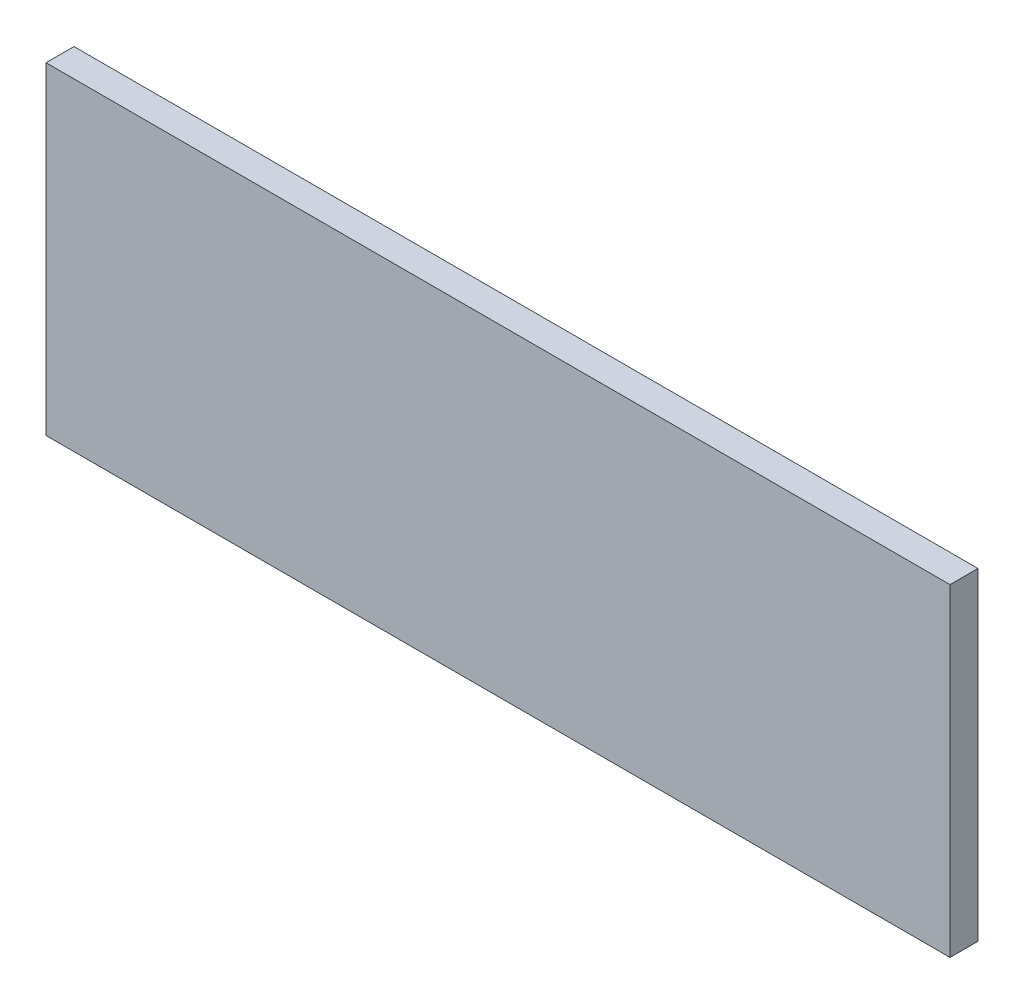
ISO-10303-21;
HEADER;
FILE_DESCRIPTION(('STEP AP214'),'2;1');
FILE_NAME('part.step','',(''),(''),'','','');
FILE_SCHEMA(('AUTOMOTIVE_DESIGN { 1 0 10303 214 1 1 1 1 }'));
ENDSEC;
DATA;
#1=APPLICATION_CONTEXT('core data for automotive mechanical design processes');
#2=APPLICATION_PROTOCOL_DEFINITION('international standard','automotive_design',2000,#1);
#3=PRODUCT_CONTEXT('',#1,'mechanical');
#4=PRODUCT('Part','Part','',(#3));
#5=PRODUCT_RELATED_PRODUCT_CATEGORY('part','',(#4));
#6=PRODUCT_DEFINITION_FORMATION('','',#4);
#7=PRODUCT_DEFINITION_CONTEXT('part definition',#1,'design');
#8=PRODUCT_DEFINITION('design','',#6,#7);
#9=PRODUCT_DEFINITION_SHAPE('','',#8);
#10=(LENGTH_UNIT() NAMED_UNIT(*) SI_UNIT(.MILLI.,.METRE.));
#11=(NAMED_UNIT(*) PLANE_ANGLE_UNIT() SI_UNIT($,.RADIAN.));
#12=(NAMED_UNIT(*) SI_UNIT($,.STERADIAN.) SOLID_ANGLE_UNIT());
#13=UNCERTAINTY_MEASURE_WITH_UNIT(LENGTH_MEASURE(1.E-05),#10,'distance_accuracy_value','');
#14=(GEOMETRIC_REPRESENTATION_CONTEXT(3) GLOBAL_UNCERTAINTY_ASSIGNED_CONTEXT((#13)) GLOBAL_UNIT_ASSIGNED_CONTEXT((#10,
#11,#12)) REPRESENTATION_CONTEXT('',''));
#15=CARTESIAN_POINT('',(0.,0.,0.));
#16=DIRECTION('',(0.,0.,1.));
#17=DIRECTION('',(1.,0.,0.));
#18=AXIS2_PLACEMENT_3D('',#15,#16,#17);
#19=CARTESIAN_POINT('',(-69.2801317233809,161.507142857143,13.));
#20=DIRECTION('',(1.,0.,0.));
#21=DIRECTION('',(0.,1.,0.));
#22=AXIS2_PLACEMENT_3D('',#19,#20,#21);
#23=PLANE('',#22);
#24=DIRECTION('',(0.,-1.,0.));
#25=VECTOR('',#24,1.);
#26=CARTESIAN_POINT('',(-69.2801317233809,161.507142857143,0.));
#27=LINE('',#26,#25);
#28=CARTESIAN_POINT('',(-69.2801317233809,161.507142857143,0.));
#29=VERTEX_POINT('',#28);
#30=CARTESIAN_POINT('',(-69.2801317233809,11.5071428571429,0.));
#31=VERTEX_POINT('',#30);
#32=EDGE_CURVE('E96',#29,#31,#27,.T.);
#33=ORIENTED_EDGE('',*,*,#32,.T.);
#34=DIRECTION('',(0.,0.,-1.));
#35=VECTOR('',#34,1.);
#36=CARTESIAN_POINT('',(-69.2801317233809,11.5071428571429,13.));
#37=LINE('',#36,#35);
#38=CARTESIAN_POINT('',(-69.2801317233809,11.5071428571429,13.));
#39=VERTEX_POINT('',#38);
#40=EDGE_CURVE('E11',#39,#31,#37,.T.);
#41=ORIENTED_EDGE('',*,*,#40,.F.);
#42=DIRECTION('',(0.,-1.,0.));
#43=VECTOR('',#42,1.);
#44=CARTESIAN_POINT('',(-69.2801317233809,161.507142857143,13.));
#45=LINE('',#44,#43);
#46=CARTESIAN_POINT('',(-69.2801317233809,161.507142857143,13.));
#47=VERTEX_POINT('',#46);
#48=EDGE_CURVE('E84',#47,#39,#45,.T.);
#49=ORIENTED_EDGE('',*,*,#48,.F.);
#50=DIRECTION('',(0.,0.,-1.));
#51=VECTOR('',#50,1.);
#52=CARTESIAN_POINT('',(-69.2801317233809,161.507142857143,13.));
#53=LINE('',#52,#51);
#54=EDGE_CURVE('E92',#47,#29,#53,.T.);
#55=ORIENTED_EDGE('',*,*,#54,.T.);
#56=EDGE_LOOP('',(#33,#41,#49,#55));
#57=FACE_BOUND('',#56,.T.);
#58=ADVANCED_FACE('F33',(#57),#23,.F.);
#59=CARTESIAN_POINT('',(-69.2801317233809,11.5071428571429,13.));
#60=DIRECTION('',(0.,1.,0.));
#61=DIRECTION('',(0.,0.,1.));
#62=AXIS2_PLACEMENT_3D('',#59,#60,#61);
#63=PLANE('',#62);
#64=DIRECTION('',(1.,0.,0.));
#65=VECTOR('',#64,1.);
#66=CARTESIAN_POINT('',(-69.2801317233809,11.5071428571429,0.));
#67=LINE('',#66,#65);
#68=CARTESIAN_POINT('',(350.719868276619,11.5071428571429,0.));
#69=VERTEX_POINT('',#68);
#70=EDGE_CURVE('E88',#31,#69,#67,.T.);
#71=ORIENTED_EDGE('',*,*,#70,.T.);
#72=DIRECTION('',(0.,0.,-1.));
#73=VECTOR('',#72,1.);
#74=CARTESIAN_POINT('',(350.719868276619,11.5071428571429,13.));
#75=LINE('',#74,#73);
#76=CARTESIAN_POINT('',(350.719868276619,11.5071428571429,13.));
#77=VERTEX_POINT('',#76);
#78=EDGE_CURVE('E41',#77,#69,#75,.T.);
#79=ORIENTED_EDGE('',*,*,#78,.F.);
#80=DIRECTION('',(1.,0.,0.));
#81=VECTOR('',#80,1.);
#82=CARTESIAN_POINT('',(-69.2801317233809,11.5071428571429,13.));
#83=LINE('',#82,#81);
#84=EDGE_CURVE('E79',#39,#77,#83,.T.);
#85=ORIENTED_EDGE('',*,*,#84,.F.);
#86=ORIENTED_EDGE('',*,*,#40,.T.);
#87=EDGE_LOOP('',(#71,#79,#85,#86));
#88=FACE_BOUND('',#87,.T.);
#89=ADVANCED_FACE('F87',(#88),#63,.F.);
#90=CARTESIAN_POINT('',(350.719868276619,161.507142857143,13.));
#91=DIRECTION('',(-1.,0.,0.));
#92=DIRECTION('',(0.,0.,1.));
#93=AXIS2_PLACEMENT_3D('',#90,#91,#92);
#94=PLANE('',#93);
#95=DIRECTION('',(0.,1.,0.));
#96=VECTOR('',#95,1.);
#97=CARTESIAN_POINT('',(350.719868276619,161.507142857143,0.));
#98=LINE('',#97,#96);
#99=CARTESIAN_POINT('',(350.719868276619,161.507142857143,0.));
#100=VERTEX_POINT('',#99);
#101=EDGE_CURVE('E66',#69,#100,#98,.T.);
#102=ORIENTED_EDGE('',*,*,#101,.T.);
#103=DIRECTION('',(0.,0.,-1.));
#104=VECTOR('',#103,1.);
#105=CARTESIAN_POINT('',(350.719868276619,161.507142857143,13.));
#106=LINE('',#105,#104);
#107=CARTESIAN_POINT('',(350.719868276619,161.507142857143,13.));
#108=VERTEX_POINT('',#107);
#109=EDGE_CURVE('E89',#108,#100,#106,.T.);
#110=ORIENTED_EDGE('',*,*,#109,.F.);
#111=DIRECTION('',(0.,1.,0.));
#112=VECTOR('',#111,1.);
#113=CARTESIAN_POINT('',(350.719868276619,161.507142857143,13.));
#114=LINE('',#113,#112);
#115=EDGE_CURVE('E82',#77,#108,#114,.T.);
#116=ORIENTED_EDGE('',*,*,#115,.F.);
#117=ORIENTED_EDGE('',*,*,#78,.T.);
#118=EDGE_LOOP('',(#102,#110,#116,#117));
#119=FACE_BOUND('',#118,.T.);
#120=ADVANCED_FACE('F90',(#119),#94,.F.);
#121=CARTESIAN_POINT('',(-69.2801317233809,161.507142857143,13.));
#122=DIRECTION('',(0.,-1.,0.));
#123=DIRECTION('',(0.,0.,-1.));
#124=AXIS2_PLACEMENT_3D('',#121,#122,#123);
#125=PLANE('',#124);
#126=DIRECTION('',(-1.,0.,0.));
#127=VECTOR('',#126,1.);
#128=CARTESIAN_POINT('',(-69.2801317233809,161.507142857143,0.));
#129=LINE('',#128,#127);
#130=EDGE_CURVE('E72',#100,#29,#129,.T.);
#131=ORIENTED_EDGE('',*,*,#130,.T.);
#132=ORIENTED_EDGE('',*,*,#54,.F.);
#133=DIRECTION('',(-1.,0.,0.));
#134=VECTOR('',#133,1.);
#135=CARTESIAN_POINT('',(-69.2801317233809,161.507142857143,13.));
#136=LINE('',#135,#134);
#137=EDGE_CURVE('E49',#108,#47,#136,.T.);
#138=ORIENTED_EDGE('',*,*,#137,.F.);
#139=ORIENTED_EDGE('',*,*,#109,.T.);
#140=EDGE_LOOP('',(#131,#132,#138,#139));
#141=FACE_BOUND('',#140,.T.);
#142=ADVANCED_FACE('F103',(#141),#125,.F.);
#143=CARTESIAN_POINT('',(0.,0.,13.));
#144=DIRECTION('',(0.,0.,1.));
#145=DIRECTION('',(1.,0.,0.));
#146=AXIS2_PLACEMENT_3D('',#143,#144,#145);
#147=PLANE('',#146);
#148=ORIENTED_EDGE('',*,*,#48,.T.);
#149=ORIENTED_EDGE('',*,*,#84,.T.);
#150=ORIENTED_EDGE('',*,*,#115,.T.);
#151=ORIENTED_EDGE('',*,*,#137,.T.);
#152=EDGE_LOOP('',(#148,#149,#150,#151));
#153=FACE_BOUND('',#152,.T.);
#154=ADVANCED_FACE('F80',(#153),#147,.T.);
#155=CARTESIAN_POINT('',(0.,0.,0.));
#156=DIRECTION('',(0.,0.,1.));
#157=DIRECTION('',(1.,0.,0.));
#158=AXIS2_PLACEMENT_3D('',#155,#156,#157);
#159=PLANE('',#158);
#160=ORIENTED_EDGE('',*,*,#32,.F.);
#161=ORIENTED_EDGE('',*,*,#130,.F.);
#162=ORIENTED_EDGE('',*,*,#101,.F.);
#163=ORIENTED_EDGE('',*,*,#70,.F.);
#164=EDGE_LOOP('',(#160,#161,#162,#163));
#165=FACE_BOUND('',#164,.T.);
#166=ADVANCED_FACE('F106',(#165),#159,.F.);
#167=CLOSED_SHELL('',(#58,#89,#120,#142,#154,#166));
#168=MANIFOLD_SOLID_BREP('B2',#167);
#169=ADVANCED_BREP_SHAPE_REPRESENTATION('',(#18,#168),#14);
#170=SHAPE_DEFINITION_REPRESENTATION(#9,#169);
ENDSEC;
END-ISO-10303-21;
